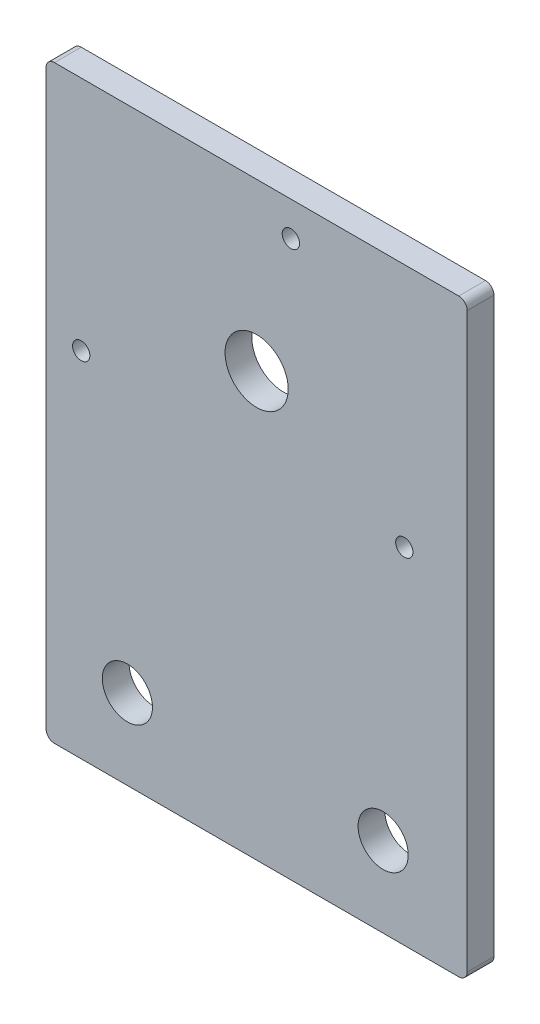
ISO-10303-21;
HEADER;
FILE_DESCRIPTION(('STEP AP214'),'2;1');
FILE_NAME('part.step','',(''),(''),'','','');
FILE_SCHEMA(('AUTOMOTIVE_DESIGN { 1 0 10303 214 1 1 1 1 }'));
ENDSEC;
DATA;
#1=APPLICATION_CONTEXT('core data for automotive mechanical design processes');
#2=APPLICATION_PROTOCOL_DEFINITION('international standard','automotive_design',2000,#1);
#3=PRODUCT_CONTEXT('',#1,'mechanical');
#4=PRODUCT('Part','Part','',(#3));
#5=PRODUCT_RELATED_PRODUCT_CATEGORY('part','',(#4));
#6=PRODUCT_DEFINITION_FORMATION('','',#4);
#7=PRODUCT_DEFINITION_CONTEXT('part definition',#1,'design');
#8=PRODUCT_DEFINITION('design','',#6,#7);
#9=PRODUCT_DEFINITION_SHAPE('','',#8);
#10=(LENGTH_UNIT() NAMED_UNIT(*) SI_UNIT(.MILLI.,.METRE.));
#11=(NAMED_UNIT(*) PLANE_ANGLE_UNIT() SI_UNIT($,.RADIAN.));
#12=(NAMED_UNIT(*) SI_UNIT($,.STERADIAN.) SOLID_ANGLE_UNIT());
#13=UNCERTAINTY_MEASURE_WITH_UNIT(LENGTH_MEASURE(1.E-05),#10,'distance_accuracy_value','');
#14=(GEOMETRIC_REPRESENTATION_CONTEXT(3) GLOBAL_UNCERTAINTY_ASSIGNED_CONTEXT((#13)) GLOBAL_UNIT_ASSIGNED_CONTEXT((#10,
#11,#12)) REPRESENTATION_CONTEXT('',''));
#15=CARTESIAN_POINT('',(0.,0.,0.));
#16=DIRECTION('',(0.,0.,1.));
#17=DIRECTION('',(1.,0.,0.));
#18=AXIS2_PLACEMENT_3D('',#15,#16,#17);
#19=CARTESIAN_POINT('',(0.,0.,6.35));
#20=DIRECTION('',(0.,0.,-1.));
#21=DIRECTION('',(-1.,0.,0.));
#22=AXIS2_PLACEMENT_3D('',#19,#20,#21);
#23=PLANE('',#22);
#24=DIRECTION('',(0.,-1.,0.));
#25=VECTOR('',#24,1.);
#26=CARTESIAN_POINT('',(-50.,-70.,6.35));
#27=LINE('',#26,#25);
#28=CARTESIAN_POINT('',(-50.,68.,6.35));
#29=VERTEX_POINT('',#28);
#30=CARTESIAN_POINT('',(-50.,-68.,6.35));
#31=VERTEX_POINT('',#30);
#32=EDGE_CURVE('E171',#29,#31,#27,.T.);
#33=ORIENTED_EDGE('',*,*,#32,.T.);
#34=CARTESIAN_POINT('',(-48.,-68.,6.35));
#35=DIRECTION('',(0.,0.,-1.));
#36=DIRECTION('',(-1.,0.,0.));
#37=AXIS2_PLACEMENT_3D('',#34,#35,#36);
#38=CIRCLE('',#37,2.);
#39=CARTESIAN_POINT('',(-48.,-70.,6.35));
#40=VERTEX_POINT('',#39);
#41=EDGE_CURVE('E148',#31,#40,#38,.F.);
#42=ORIENTED_EDGE('',*,*,#41,.T.);
#43=DIRECTION('',(1.,0.,0.));
#44=VECTOR('',#43,1.);
#45=CARTESIAN_POINT('',(-50.,-70.,6.35));
#46=LINE('',#45,#44);
#47=CARTESIAN_POINT('',(48.,-70.,6.35));
#48=VERTEX_POINT('',#47);
#49=EDGE_CURVE('E119',#40,#48,#46,.T.);
#50=ORIENTED_EDGE('',*,*,#49,.T.);
#51=CARTESIAN_POINT('',(48.,-68.,6.35));
#52=DIRECTION('',(0.,0.,-1.));
#53=DIRECTION('',(-1.,0.,0.));
#54=AXIS2_PLACEMENT_3D('',#51,#52,#53);
#55=CIRCLE('',#54,2.);
#56=CARTESIAN_POINT('',(50.,-68.,6.35));
#57=VERTEX_POINT('',#56);
#58=EDGE_CURVE('E146',#48,#57,#55,.F.);
#59=ORIENTED_EDGE('',*,*,#58,.T.);
#60=DIRECTION('',(0.,1.,0.));
#61=VECTOR('',#60,1.);
#62=CARTESIAN_POINT('',(50.,-70.,6.35));
#63=LINE('',#62,#61);
#64=CARTESIAN_POINT('',(50.,68.,6.35));
#65=VERTEX_POINT('',#64);
#66=EDGE_CURVE('E126',#57,#65,#63,.T.);
#67=ORIENTED_EDGE('',*,*,#66,.T.);
#68=CARTESIAN_POINT('',(48.,68.,6.35));
#69=DIRECTION('',(0.,0.,-1.));
#70=DIRECTION('',(-1.,0.,0.));
#71=AXIS2_PLACEMENT_3D('',#68,#69,#70);
#72=CIRCLE('',#71,2.);
#73=CARTESIAN_POINT('',(48.,70.,6.35));
#74=VERTEX_POINT('',#73);
#75=EDGE_CURVE('E54',#65,#74,#72,.F.);
#76=ORIENTED_EDGE('',*,*,#75,.T.);
#77=DIRECTION('',(-1.,0.,0.));
#78=VECTOR('',#77,1.);
#79=CARTESIAN_POINT('',(-50.,70.,6.35));
#80=LINE('',#79,#78);
#81=CARTESIAN_POINT('',(-48.,70.,6.35));
#82=VERTEX_POINT('',#81);
#83=EDGE_CURVE('E129',#74,#82,#80,.T.);
#84=ORIENTED_EDGE('',*,*,#83,.T.);
#85=CARTESIAN_POINT('',(-48.,68.,6.35));
#86=DIRECTION('',(0.,0.,-1.));
#87=DIRECTION('',(-1.,0.,0.));
#88=AXIS2_PLACEMENT_3D('',#85,#86,#87);
#89=CIRCLE('',#88,2.);
#90=EDGE_CURVE('E143',#82,#29,#89,.F.);
#91=ORIENTED_EDGE('',*,*,#90,.T.);
#92=EDGE_LOOP('',(#33,#42,#50,#59,#67,#76,#84,#91));
#93=FACE_BOUND('',#92,.T.);
#94=CARTESIAN_POINT('',(-30.6912993078579,-50.95,6.35));
#95=DIRECTION('',(0.,0.,1.));
#96=DIRECTION('',(1.,0.,0.));
#97=AXIS2_PLACEMENT_3D('',#94,#95,#96);
#98=CIRCLE('',#97,5.95376240135131);
#99=CARTESIAN_POINT('',(-24.7375369065066,-50.95,6.35));
#100=VERTEX_POINT('',#99);
#101=EDGE_CURVE('E164',#100,#100,#98,.T.);
#102=ORIENTED_EDGE('',*,*,#101,.F.);
#103=EDGE_LOOP('',(#102));
#104=FACE_BOUND('',#103,.T.);
#105=CARTESIAN_POINT('',(30.0408539650475,-50.95,6.35));
#106=DIRECTION('',(0.,0.,1.));
#107=DIRECTION('',(1.,0.,0.));
#108=AXIS2_PLACEMENT_3D('',#105,#106,#107);
#109=CIRCLE('',#108,5.95376240135131);
#110=CARTESIAN_POINT('',(35.9946163663989,-50.95,6.35));
#111=VERTEX_POINT('',#110);
#112=EDGE_CURVE('E176',#111,#111,#109,.T.);
#113=ORIENTED_EDGE('',*,*,#112,.F.);
#114=EDGE_LOOP('',(#113));
#115=FACE_BOUND('',#114,.T.);
#116=CARTESIAN_POINT('',(-41.6504848608634,13.9226789797873,6.35));
#117=DIRECTION('',(0.,0.,1.));
#118=DIRECTION('',(1.,0.,0.));
#119=AXIS2_PLACEMENT_3D('',#116,#117,#118);
#120=CIRCLE('',#119,2.05484729118853);
#121=CARTESIAN_POINT('',(-39.5956375696749,13.9226789797873,6.35));
#122=VERTEX_POINT('',#121);
#123=EDGE_CURVE('E181',#122,#122,#120,.T.);
#124=ORIENTED_EDGE('',*,*,#123,.F.);
#125=EDGE_LOOP('',(#124));
#126=FACE_BOUND('',#125,.T.);
#127=CARTESIAN_POINT('',(8.12248285903652,61.8691157741863,6.35));
#128=DIRECTION('',(0.,0.,1.));
#129=DIRECTION('',(1.,0.,0.));
#130=AXIS2_PLACEMENT_3D('',#127,#128,#129);
#131=CIRCLE('',#130,2.05484729118853);
#132=CARTESIAN_POINT('',(10.1773301502251,61.8691157741863,6.35));
#133=VERTEX_POINT('',#132);
#134=EDGE_CURVE('E187',#133,#133,#131,.T.);
#135=ORIENTED_EDGE('',*,*,#134,.F.);
#136=EDGE_LOOP('',(#135));
#137=FACE_BOUND('',#136,.T.);
#138=CARTESIAN_POINT('',(35.063814010175,11.8678316885988,6.35));
#139=DIRECTION('',(0.,0.,1.));
#140=DIRECTION('',(1.,0.,0.));
#141=AXIS2_PLACEMENT_3D('',#138,#139,#140);
#142=CIRCLE('',#141,2.05484729118853);
#143=CARTESIAN_POINT('',(37.1186613013636,11.8678316885988,6.35));
#144=VERTEX_POINT('',#143);
#145=EDGE_CURVE('E193',#144,#144,#142,.T.);
#146=ORIENTED_EDGE('',*,*,#145,.F.);
#147=EDGE_LOOP('',(#146));
#148=FACE_BOUND('',#147,.T.);
#149=CARTESIAN_POINT('',(0.,30.5820098825151,6.35));
#150=DIRECTION('',(0.,0.,1.));
#151=DIRECTION('',(1.,0.,0.));
#152=AXIS2_PLACEMENT_3D('',#149,#150,#151);
#153=CIRCLE('',#152,7.5);
#154=CARTESIAN_POINT('',(7.5,30.5820098825151,6.35));
#155=VERTEX_POINT('',#154);
#156=EDGE_CURVE('E199',#155,#155,#153,.T.);
#157=ORIENTED_EDGE('',*,*,#156,.F.);
#158=EDGE_LOOP('',(#157));
#159=FACE_BOUND('',#158,.T.);
#160=ADVANCED_FACE('F33',(#93,#104,#115,#126,#137,#148,#159),#23,.F.);
#161=CARTESIAN_POINT('',(0.,0.,0.));
#162=DIRECTION('',(0.,0.,-1.));
#163=DIRECTION('',(-1.,0.,0.));
#164=AXIS2_PLACEMENT_3D('',#161,#162,#163);
#165=PLANE('',#164);
#166=CARTESIAN_POINT('',(35.063814010175,11.8678316885988,0.));
#167=DIRECTION('',(0.,0.,1.));
#168=DIRECTION('',(1.,0.,0.));
#169=AXIS2_PLACEMENT_3D('',#166,#167,#168);
#170=CIRCLE('',#169,2.05484729118853);
#171=CARTESIAN_POINT('',(37.1186613013636,11.8678316885988,0.));
#172=VERTEX_POINT('',#171);
#173=EDGE_CURVE('E196',#172,#172,#170,.T.);
#174=ORIENTED_EDGE('',*,*,#173,.T.);
#175=EDGE_LOOP('',(#174));
#176=FACE_BOUND('',#175,.T.);
#177=CARTESIAN_POINT('',(-41.6504848608634,13.9226789797873,0.));
#178=DIRECTION('',(0.,0.,1.));
#179=DIRECTION('',(1.,0.,0.));
#180=AXIS2_PLACEMENT_3D('',#177,#178,#179);
#181=CIRCLE('',#180,2.05484729118853);
#182=CARTESIAN_POINT('',(-39.5956375696749,13.9226789797873,0.));
#183=VERTEX_POINT('',#182);
#184=EDGE_CURVE('E184',#183,#183,#181,.T.);
#185=ORIENTED_EDGE('',*,*,#184,.T.);
#186=EDGE_LOOP('',(#185));
#187=FACE_BOUND('',#186,.T.);
#188=CARTESIAN_POINT('',(-30.6912993078579,-50.95,0.));
#189=DIRECTION('',(0.,0.,1.));
#190=DIRECTION('',(1.,0.,0.));
#191=AXIS2_PLACEMENT_3D('',#188,#189,#190);
#192=CIRCLE('',#191,5.95376240135131);
#193=CARTESIAN_POINT('',(-24.7375369065066,-50.95,0.));
#194=VERTEX_POINT('',#193);
#195=EDGE_CURVE('E167',#194,#194,#192,.T.);
#196=ORIENTED_EDGE('',*,*,#195,.T.);
#197=EDGE_LOOP('',(#196));
#198=FACE_BOUND('',#197,.T.);
#199=DIRECTION('',(1.,0.,0.));
#200=VECTOR('',#199,1.);
#201=CARTESIAN_POINT('',(-50.,-70.,0.));
#202=LINE('',#201,#200);
#203=CARTESIAN_POINT('',(-48.,-70.,0.));
#204=VERTEX_POINT('',#203);
#205=CARTESIAN_POINT('',(48.,-70.,0.));
#206=VERTEX_POINT('',#205);
#207=EDGE_CURVE('E116',#204,#206,#202,.T.);
#208=ORIENTED_EDGE('',*,*,#207,.F.);
#209=CARTESIAN_POINT('',(-48.,-68.,0.));
#210=DIRECTION('',(0.,0.,-1.));
#211=DIRECTION('',(-1.,0.,0.));
#212=AXIS2_PLACEMENT_3D('',#209,#210,#211);
#213=CIRCLE('',#212,2.);
#214=CARTESIAN_POINT('',(-50.,-68.,0.));
#215=VERTEX_POINT('',#214);
#216=EDGE_CURVE('E99',#204,#215,#213,.T.);
#217=ORIENTED_EDGE('',*,*,#216,.T.);
#218=DIRECTION('',(0.,-1.,0.));
#219=VECTOR('',#218,1.);
#220=CARTESIAN_POINT('',(-50.,-70.,0.));
#221=LINE('',#220,#219);
#222=CARTESIAN_POINT('',(-50.,68.,0.));
#223=VERTEX_POINT('',#222);
#224=EDGE_CURVE('E127',#223,#215,#221,.T.);
#225=ORIENTED_EDGE('',*,*,#224,.F.);
#226=CARTESIAN_POINT('',(-48.,68.,0.));
#227=DIRECTION('',(0.,0.,-1.));
#228=DIRECTION('',(-1.,0.,0.));
#229=AXIS2_PLACEMENT_3D('',#226,#227,#228);
#230=CIRCLE('',#229,2.);
#231=CARTESIAN_POINT('',(-48.,70.,0.));
#232=VERTEX_POINT('',#231);
#233=EDGE_CURVE('E120',#223,#232,#230,.T.);
#234=ORIENTED_EDGE('',*,*,#233,.T.);
#235=DIRECTION('',(-1.,0.,0.));
#236=VECTOR('',#235,1.);
#237=CARTESIAN_POINT('',(-50.,70.,0.));
#238=LINE('',#237,#236);
#239=CARTESIAN_POINT('',(48.,70.,0.));
#240=VERTEX_POINT('',#239);
#241=EDGE_CURVE('E131',#240,#232,#238,.T.);
#242=ORIENTED_EDGE('',*,*,#241,.F.);
#243=CARTESIAN_POINT('',(48.,68.,0.));
#244=DIRECTION('',(0.,0.,-1.));
#245=DIRECTION('',(-1.,0.,0.));
#246=AXIS2_PLACEMENT_3D('',#243,#244,#245);
#247=CIRCLE('',#246,2.);
#248=CARTESIAN_POINT('',(50.,68.,0.));
#249=VERTEX_POINT('',#248);
#250=EDGE_CURVE('E137',#240,#249,#247,.T.);
#251=ORIENTED_EDGE('',*,*,#250,.T.);
#252=DIRECTION('',(0.,1.,0.));
#253=VECTOR('',#252,1.);
#254=CARTESIAN_POINT('',(50.,-70.,0.));
#255=LINE('',#254,#253);
#256=CARTESIAN_POINT('',(50.,-68.,0.));
#257=VERTEX_POINT('',#256);
#258=EDGE_CURVE('E159',#257,#249,#255,.T.);
#259=ORIENTED_EDGE('',*,*,#258,.F.);
#260=CARTESIAN_POINT('',(48.,-68.,0.));
#261=DIRECTION('',(0.,0.,-1.));
#262=DIRECTION('',(-1.,0.,0.));
#263=AXIS2_PLACEMENT_3D('',#260,#261,#262);
#264=CIRCLE('',#263,2.);
#265=EDGE_CURVE('E110',#257,#206,#264,.T.);
#266=ORIENTED_EDGE('',*,*,#265,.T.);
#267=EDGE_LOOP('',(#208,#217,#225,#234,#242,#251,#259,#266));
#268=FACE_BOUND('',#267,.T.);
#269=CARTESIAN_POINT('',(30.0408539650475,-50.95,0.));
#270=DIRECTION('',(0.,0.,1.));
#271=DIRECTION('',(1.,0.,0.));
#272=AXIS2_PLACEMENT_3D('',#269,#270,#271);
#273=CIRCLE('',#272,5.95376240135131);
#274=CARTESIAN_POINT('',(35.9946163663989,-50.95,0.));
#275=VERTEX_POINT('',#274);
#276=EDGE_CURVE('E178',#275,#275,#273,.T.);
#277=ORIENTED_EDGE('',*,*,#276,.T.);
#278=EDGE_LOOP('',(#277));
#279=FACE_BOUND('',#278,.T.);
#280=CARTESIAN_POINT('',(8.12248285903652,61.8691157741863,0.));
#281=DIRECTION('',(0.,0.,1.));
#282=DIRECTION('',(1.,0.,0.));
#283=AXIS2_PLACEMENT_3D('',#280,#281,#282);
#284=CIRCLE('',#283,2.05484729118853);
#285=CARTESIAN_POINT('',(10.1773301502251,61.8691157741863,0.));
#286=VERTEX_POINT('',#285);
#287=EDGE_CURVE('E190',#286,#286,#284,.T.);
#288=ORIENTED_EDGE('',*,*,#287,.T.);
#289=EDGE_LOOP('',(#288));
#290=FACE_BOUND('',#289,.T.);
#291=CARTESIAN_POINT('',(0.,30.5820098825151,0.));
#292=DIRECTION('',(0.,0.,1.));
#293=DIRECTION('',(1.,0.,0.));
#294=AXIS2_PLACEMENT_3D('',#291,#292,#293);
#295=CIRCLE('',#294,7.5);
#296=CARTESIAN_POINT('',(7.5,30.5820098825151,0.));
#297=VERTEX_POINT('',#296);
#298=EDGE_CURVE('E202',#297,#297,#295,.T.);
#299=ORIENTED_EDGE('',*,*,#298,.T.);
#300=EDGE_LOOP('',(#299));
#301=FACE_BOUND('',#300,.T.);
#302=ADVANCED_FACE('F123',(#176,#187,#198,#268,#279,#290,#301),#165,.T.);
#303=CARTESIAN_POINT('',(50.,-70.,6.35));
#304=DIRECTION('',(-1.,0.,0.));
#305=DIRECTION('',(0.,0.,1.));
#306=AXIS2_PLACEMENT_3D('',#303,#304,#305);
#307=PLANE('',#306);
#308=ORIENTED_EDGE('',*,*,#66,.F.);
#309=DIRECTION('',(0.,0.,-1.));
#310=VECTOR('',#309,1.);
#311=CARTESIAN_POINT('',(50.,-68.,6.35));
#312=LINE('',#311,#310);
#313=EDGE_CURVE('E152',#57,#257,#312,.T.);
#314=ORIENTED_EDGE('',*,*,#313,.T.);
#315=ORIENTED_EDGE('',*,*,#258,.T.);
#316=DIRECTION('',(0.,0.,-1.));
#317=VECTOR('',#316,1.);
#318=CARTESIAN_POINT('',(50.,68.,6.35));
#319=LINE('',#318,#317);
#320=EDGE_CURVE('E150',#249,#65,#319,.F.);
#321=ORIENTED_EDGE('',*,*,#320,.T.);
#322=EDGE_LOOP('',(#308,#314,#315,#321));
#323=FACE_BOUND('',#322,.T.);
#324=ADVANCED_FACE('F158',(#323),#307,.F.);
#325=CARTESIAN_POINT('',(-50.,70.,6.35));
#326=DIRECTION('',(0.,-1.,0.));
#327=DIRECTION('',(0.,0.,-1.));
#328=AXIS2_PLACEMENT_3D('',#325,#326,#327);
#329=PLANE('',#328);
#330=ORIENTED_EDGE('',*,*,#83,.F.);
#331=DIRECTION('',(0.,0.,-1.));
#332=VECTOR('',#331,1.);
#333=CARTESIAN_POINT('',(48.,70.,6.35));
#334=LINE('',#333,#332);
#335=EDGE_CURVE('E11',#74,#240,#334,.T.);
#336=ORIENTED_EDGE('',*,*,#335,.T.);
#337=ORIENTED_EDGE('',*,*,#241,.T.);
#338=DIRECTION('',(0.,0.,-1.));
#339=VECTOR('',#338,1.);
#340=CARTESIAN_POINT('',(-48.,70.,6.35));
#341=LINE('',#340,#339);
#342=EDGE_CURVE('E41',#232,#82,#341,.F.);
#343=ORIENTED_EDGE('',*,*,#342,.T.);
#344=EDGE_LOOP('',(#330,#336,#337,#343));
#345=FACE_BOUND('',#344,.T.);
#346=ADVANCED_FACE('F228',(#345),#329,.F.);
#347=CARTESIAN_POINT('',(-50.,-70.,6.35));
#348=DIRECTION('',(1.,0.,0.));
#349=DIRECTION('',(0.,0.,-1.));
#350=AXIS2_PLACEMENT_3D('',#347,#348,#349);
#351=PLANE('',#350);
#352=ORIENTED_EDGE('',*,*,#224,.T.);
#353=DIRECTION('',(0.,0.,-1.));
#354=VECTOR('',#353,1.);
#355=CARTESIAN_POINT('',(-50.,-68.,6.35));
#356=LINE('',#355,#354);
#357=EDGE_CURVE('E104',#215,#31,#356,.F.);
#358=ORIENTED_EDGE('',*,*,#357,.T.);
#359=ORIENTED_EDGE('',*,*,#32,.F.);
#360=DIRECTION('',(0.,0.,-1.));
#361=VECTOR('',#360,1.);
#362=CARTESIAN_POINT('',(-50.,68.,6.35));
#363=LINE('',#362,#361);
#364=EDGE_CURVE('E109',#29,#223,#363,.T.);
#365=ORIENTED_EDGE('',*,*,#364,.T.);
#366=EDGE_LOOP('',(#352,#358,#359,#365));
#367=FACE_BOUND('',#366,.T.);
#368=ADVANCED_FACE('F225',(#367),#351,.F.);
#369=CARTESIAN_POINT('',(-50.,-70.,6.35));
#370=DIRECTION('',(0.,1.,0.));
#371=DIRECTION('',(0.,0.,1.));
#372=AXIS2_PLACEMENT_3D('',#369,#370,#371);
#373=PLANE('',#372);
#374=ORIENTED_EDGE('',*,*,#49,.F.);
#375=DIRECTION('',(0.,0.,-1.));
#376=VECTOR('',#375,1.);
#377=CARTESIAN_POINT('',(-48.,-70.,6.35));
#378=LINE('',#377,#376);
#379=EDGE_CURVE('E103',#40,#204,#378,.T.);
#380=ORIENTED_EDGE('',*,*,#379,.T.);
#381=ORIENTED_EDGE('',*,*,#207,.T.);
#382=DIRECTION('',(0.,0.,-1.));
#383=VECTOR('',#382,1.);
#384=CARTESIAN_POINT('',(48.,-70.,6.35));
#385=LINE('',#384,#383);
#386=EDGE_CURVE('E121',#206,#48,#385,.F.);
#387=ORIENTED_EDGE('',*,*,#386,.T.);
#388=EDGE_LOOP('',(#374,#380,#381,#387));
#389=FACE_BOUND('',#388,.T.);
#390=ADVANCED_FACE('F115',(#389),#373,.F.);
#391=CARTESIAN_POINT('',(-30.6912993078579,-50.95,6.35));
#392=DIRECTION('',(0.,0.,-1.));
#393=DIRECTION('',(-1.,0.,0.));
#394=AXIS2_PLACEMENT_3D('',#391,#392,#393);
#395=CYLINDRICAL_SURFACE('',#394,5.95376240135131);
#396=ORIENTED_EDGE('',*,*,#101,.T.);
#397=EDGE_LOOP('',(#396));
#398=FACE_BOUND('',#397,.T.);
#399=ORIENTED_EDGE('',*,*,#195,.F.);
#400=EDGE_LOOP('',(#399));
#401=FACE_BOUND('',#400,.T.);
#402=ADVANCED_FACE('F220',(#398,#401),#395,.F.);
#403=CARTESIAN_POINT('',(30.0408539650475,-50.95,6.35));
#404=DIRECTION('',(0.,0.,-1.));
#405=DIRECTION('',(-1.,0.,0.));
#406=AXIS2_PLACEMENT_3D('',#403,#404,#405);
#407=CYLINDRICAL_SURFACE('',#406,5.95376240135131);
#408=ORIENTED_EDGE('',*,*,#112,.T.);
#409=EDGE_LOOP('',(#408));
#410=FACE_BOUND('',#409,.T.);
#411=ORIENTED_EDGE('',*,*,#276,.F.);
#412=EDGE_LOOP('',(#411));
#413=FACE_BOUND('',#412,.T.);
#414=ADVANCED_FACE('F341',(#410,#413),#407,.F.);
#415=CARTESIAN_POINT('',(-41.6504848608634,13.9226789797873,6.35));
#416=DIRECTION('',(0.,0.,-1.));
#417=DIRECTION('',(-1.,0.,0.));
#418=AXIS2_PLACEMENT_3D('',#415,#416,#417);
#419=CYLINDRICAL_SURFACE('',#418,2.05484729118853);
#420=ORIENTED_EDGE('',*,*,#123,.T.);
#421=EDGE_LOOP('',(#420));
#422=FACE_BOUND('',#421,.T.);
#423=ORIENTED_EDGE('',*,*,#184,.F.);
#424=EDGE_LOOP('',(#423));
#425=FACE_BOUND('',#424,.T.);
#426=ADVANCED_FACE('F331',(#422,#425),#419,.F.);
#427=CARTESIAN_POINT('',(8.12248285903652,61.8691157741863,6.35));
#428=DIRECTION('',(0.,0.,-1.));
#429=DIRECTION('',(-1.,0.,0.));
#430=AXIS2_PLACEMENT_3D('',#427,#428,#429);
#431=CYLINDRICAL_SURFACE('',#430,2.05484729118853);
#432=ORIENTED_EDGE('',*,*,#134,.T.);
#433=EDGE_LOOP('',(#432));
#434=FACE_BOUND('',#433,.T.);
#435=ORIENTED_EDGE('',*,*,#287,.F.);
#436=EDGE_LOOP('',(#435));
#437=FACE_BOUND('',#436,.T.);
#438=ADVANCED_FACE('F321',(#434,#437),#431,.F.);
#439=CARTESIAN_POINT('',(35.063814010175,11.8678316885988,6.35));
#440=DIRECTION('',(0.,0.,-1.));
#441=DIRECTION('',(-1.,0.,0.));
#442=AXIS2_PLACEMENT_3D('',#439,#440,#441);
#443=CYLINDRICAL_SURFACE('',#442,2.05484729118853);
#444=ORIENTED_EDGE('',*,*,#145,.T.);
#445=EDGE_LOOP('',(#444));
#446=FACE_BOUND('',#445,.T.);
#447=ORIENTED_EDGE('',*,*,#173,.F.);
#448=EDGE_LOOP('',(#447));
#449=FACE_BOUND('',#448,.T.);
#450=ADVANCED_FACE('F312',(#446,#449),#443,.F.);
#451=CARTESIAN_POINT('',(0.,30.5820098825151,6.35));
#452=DIRECTION('',(0.,0.,-1.));
#453=DIRECTION('',(-1.,0.,0.));
#454=AXIS2_PLACEMENT_3D('',#451,#452,#453);
#455=CYLINDRICAL_SURFACE('',#454,7.5);
#456=ORIENTED_EDGE('',*,*,#156,.T.);
#457=EDGE_LOOP('',(#456));
#458=FACE_BOUND('',#457,.T.);
#459=ORIENTED_EDGE('',*,*,#298,.F.);
#460=EDGE_LOOP('',(#459));
#461=FACE_BOUND('',#460,.T.);
#462=ADVANCED_FACE('F208',(#458,#461),#455,.F.);
#463=CARTESIAN_POINT('',(-48.,-68.,6.35));
#464=DIRECTION('',(0.,0.,-1.));
#465=DIRECTION('',(-1.,0.,0.));
#466=AXIS2_PLACEMENT_3D('',#463,#464,#465);
#467=CYLINDRICAL_SURFACE('',#466,2.);
#468=ORIENTED_EDGE('',*,*,#41,.F.);
#469=ORIENTED_EDGE('',*,*,#357,.F.);
#470=ORIENTED_EDGE('',*,*,#216,.F.);
#471=ORIENTED_EDGE('',*,*,#379,.F.);
#472=EDGE_LOOP('',(#468,#469,#470,#471));
#473=FACE_BOUND('',#472,.T.);
#474=ADVANCED_FACE('F102',(#473),#467,.T.);
#475=CARTESIAN_POINT('',(48.,-68.,6.35));
#476=DIRECTION('',(0.,0.,-1.));
#477=DIRECTION('',(-1.,0.,0.));
#478=AXIS2_PLACEMENT_3D('',#475,#476,#477);
#479=CYLINDRICAL_SURFACE('',#478,2.);
#480=ORIENTED_EDGE('',*,*,#58,.F.);
#481=ORIENTED_EDGE('',*,*,#386,.F.);
#482=ORIENTED_EDGE('',*,*,#265,.F.);
#483=ORIENTED_EDGE('',*,*,#313,.F.);
#484=EDGE_LOOP('',(#480,#481,#482,#483));
#485=FACE_BOUND('',#484,.T.);
#486=ADVANCED_FACE('F236',(#485),#479,.T.);
#487=CARTESIAN_POINT('',(48.,68.,6.35));
#488=DIRECTION('',(0.,0.,-1.));
#489=DIRECTION('',(-1.,0.,0.));
#490=AXIS2_PLACEMENT_3D('',#487,#488,#489);
#491=CYLINDRICAL_SURFACE('',#490,2.);
#492=ORIENTED_EDGE('',*,*,#75,.F.);
#493=ORIENTED_EDGE('',*,*,#320,.F.);
#494=ORIENTED_EDGE('',*,*,#250,.F.);
#495=ORIENTED_EDGE('',*,*,#335,.F.);
#496=EDGE_LOOP('',(#492,#493,#494,#495));
#497=FACE_BOUND('',#496,.T.);
#498=ADVANCED_FACE('F238',(#497),#491,.T.);
#499=CARTESIAN_POINT('',(-48.,68.,6.35));
#500=DIRECTION('',(0.,0.,-1.));
#501=DIRECTION('',(-1.,0.,0.));
#502=AXIS2_PLACEMENT_3D('',#499,#500,#501);
#503=CYLINDRICAL_SURFACE('',#502,2.);
#504=ORIENTED_EDGE('',*,*,#90,.F.);
#505=ORIENTED_EDGE('',*,*,#342,.F.);
#506=ORIENTED_EDGE('',*,*,#233,.F.);
#507=ORIENTED_EDGE('',*,*,#364,.F.);
#508=EDGE_LOOP('',(#504,#505,#506,#507));
#509=FACE_BOUND('',#508,.T.);
#510=ADVANCED_FACE('F35',(#509),#503,.T.);
#511=CLOSED_SHELL('',(#160,#302,#324,#346,#368,#390,#402,#414,#426,#438,#450,#462,#474,#486,
#498,#510));
#512=MANIFOLD_SOLID_BREP('B2',#511);
#513=ADVANCED_BREP_SHAPE_REPRESENTATION('',(#18,#512),#14);
#514=SHAPE_DEFINITION_REPRESENTATION(#9,#513);
ENDSEC;
END-ISO-10303-21;
